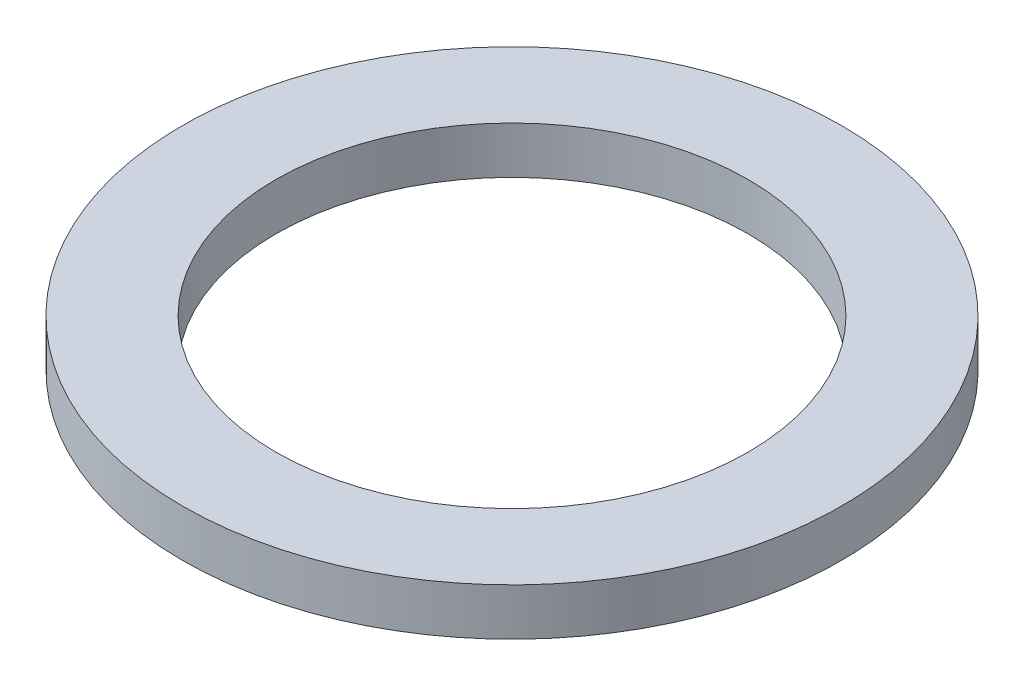
ISO-10303-21;
HEADER;
FILE_DESCRIPTION(('STEP AP214'),'2;1');
FILE_NAME('part.step','',(''),(''),'','','');
FILE_SCHEMA(('AUTOMOTIVE_DESIGN { 1 0 10303 214 1 1 1 1 }'));
ENDSEC;
DATA;
#1=APPLICATION_CONTEXT('core data for automotive mechanical design processes');
#2=APPLICATION_PROTOCOL_DEFINITION('international standard','automotive_design',2000,#1);
#3=PRODUCT_CONTEXT('',#1,'mechanical');
#4=PRODUCT('Part','Part','',(#3));
#5=PRODUCT_RELATED_PRODUCT_CATEGORY('part','',(#4));
#6=PRODUCT_DEFINITION_FORMATION('','',#4);
#7=PRODUCT_DEFINITION_CONTEXT('part definition',#1,'design');
#8=PRODUCT_DEFINITION('design','',#6,#7);
#9=PRODUCT_DEFINITION_SHAPE('','',#8);
#10=(LENGTH_UNIT() NAMED_UNIT(*) SI_UNIT(.MILLI.,.METRE.));
#11=(NAMED_UNIT(*) PLANE_ANGLE_UNIT() SI_UNIT($,.RADIAN.));
#12=(NAMED_UNIT(*) SI_UNIT($,.STERADIAN.) SOLID_ANGLE_UNIT());
#13=UNCERTAINTY_MEASURE_WITH_UNIT(LENGTH_MEASURE(1.E-05),#10,'distance_accuracy_value','');
#14=(GEOMETRIC_REPRESENTATION_CONTEXT(3) GLOBAL_UNCERTAINTY_ASSIGNED_CONTEXT((#13)) GLOBAL_UNIT_ASSIGNED_CONTEXT((#10,
#11,#12)) REPRESENTATION_CONTEXT('',''));
#15=CARTESIAN_POINT('',(0.,0.,0.));
#16=DIRECTION('',(0.,0.,1.));
#17=DIRECTION('',(1.,0.,0.));
#18=AXIS2_PLACEMENT_3D('',#15,#16,#17);
#19=CARTESIAN_POINT('',(0.,1.5875,0.));
#20=DIRECTION('',(0.,1.,0.));
#21=DIRECTION('',(0.,0.,1.));
#22=AXIS2_PLACEMENT_3D('',#19,#20,#21);
#23=PLANE('',#22);
#24=CARTESIAN_POINT('',(0.,1.5875,0.));
#25=DIRECTION('',(0.,1.,0.));
#26=DIRECTION('',(0.,0.,1.));
#27=AXIS2_PLACEMENT_3D('',#24,#25,#26);
#28=CIRCLE('',#27,11.1125);
#29=CARTESIAN_POINT('',(0.,1.5875,11.1125));
#30=VERTEX_POINT('',#29);
#31=EDGE_CURVE('E10',#30,#30,#28,.T.);
#32=ORIENTED_EDGE('',*,*,#31,.T.);
#33=EDGE_LOOP('',(#32));
#34=FACE_BOUND('',#33,.T.);
#35=CARTESIAN_POINT('',(0.,1.5875,0.));
#36=DIRECTION('',(0.,1.,0.));
#37=DIRECTION('',(0.,0.,1.));
#38=AXIS2_PLACEMENT_3D('',#35,#36,#37);
#39=CIRCLE('',#38,7.9629);
#40=CARTESIAN_POINT('',(0.,1.5875,7.9629));
#41=VERTEX_POINT('',#40);
#42=EDGE_CURVE('E42',#41,#41,#39,.T.);
#43=ORIENTED_EDGE('',*,*,#42,.F.);
#44=EDGE_LOOP('',(#43));
#45=FACE_BOUND('',#44,.T.);
#46=ADVANCED_FACE('F31',(#34,#45),#23,.T.);
#47=CARTESIAN_POINT('',(0.,0.,0.));
#48=DIRECTION('',(0.,1.,0.));
#49=DIRECTION('',(0.,0.,1.));
#50=AXIS2_PLACEMENT_3D('',#47,#48,#49);
#51=PLANE('',#50);
#52=CARTESIAN_POINT('',(0.,0.,0.));
#53=DIRECTION('',(0.,1.,0.));
#54=DIRECTION('',(0.,0.,1.));
#55=AXIS2_PLACEMENT_3D('',#52,#53,#54);
#56=CIRCLE('',#55,11.1125);
#57=CARTESIAN_POINT('',(0.,0.,11.1125));
#58=VERTEX_POINT('',#57);
#59=EDGE_CURVE('E35',#58,#58,#56,.T.);
#60=ORIENTED_EDGE('',*,*,#59,.F.);
#61=EDGE_LOOP('',(#60));
#62=FACE_BOUND('',#61,.T.);
#63=CARTESIAN_POINT('',(0.,0.,0.));
#64=DIRECTION('',(0.,1.,0.));
#65=DIRECTION('',(0.,0.,1.));
#66=AXIS2_PLACEMENT_3D('',#63,#64,#65);
#67=CIRCLE('',#66,7.9629);
#68=CARTESIAN_POINT('',(0.,0.,7.9629));
#69=VERTEX_POINT('',#68);
#70=EDGE_CURVE('E44',#69,#69,#67,.T.);
#71=ORIENTED_EDGE('',*,*,#70,.T.);
#72=EDGE_LOOP('',(#71));
#73=FACE_BOUND('',#72,.T.);
#74=ADVANCED_FACE('F54',(#62,#73),#51,.F.);
#75=CARTESIAN_POINT('',(0.,1.5875,0.));
#76=DIRECTION('',(0.,-1.,0.));
#77=DIRECTION('',(0.,0.,-1.));
#78=AXIS2_PLACEMENT_3D('',#75,#76,#77);
#79=CYLINDRICAL_SURFACE('',#78,11.1125);
#80=ORIENTED_EDGE('',*,*,#31,.F.);
#81=EDGE_LOOP('',(#80));
#82=FACE_BOUND('',#81,.T.);
#83=ORIENTED_EDGE('',*,*,#59,.T.);
#84=EDGE_LOOP('',(#83));
#85=FACE_BOUND('',#84,.T.);
#86=ADVANCED_FACE('F33',(#82,#85),#79,.T.);
#87=CARTESIAN_POINT('',(0.,1.5875,0.));
#88=DIRECTION('',(0.,-1.,0.));
#89=DIRECTION('',(0.,0.,-1.));
#90=AXIS2_PLACEMENT_3D('',#87,#88,#89);
#91=CYLINDRICAL_SURFACE('',#90,7.9629);
#92=ORIENTED_EDGE('',*,*,#42,.T.);
#93=EDGE_LOOP('',(#92));
#94=FACE_BOUND('',#93,.T.);
#95=ORIENTED_EDGE('',*,*,#70,.F.);
#96=EDGE_LOOP('',(#95));
#97=FACE_BOUND('',#96,.T.);
#98=ADVANCED_FACE('F50',(#94,#97),#91,.F.);
#99=CLOSED_SHELL('',(#46,#74,#86,#98));
#100=MANIFOLD_SOLID_BREP('B2',#99);
#101=ADVANCED_BREP_SHAPE_REPRESENTATION('',(#18,#100),#14);
#102=SHAPE_DEFINITION_REPRESENTATION(#9,#101);
ENDSEC;
END-ISO-10303-21;
